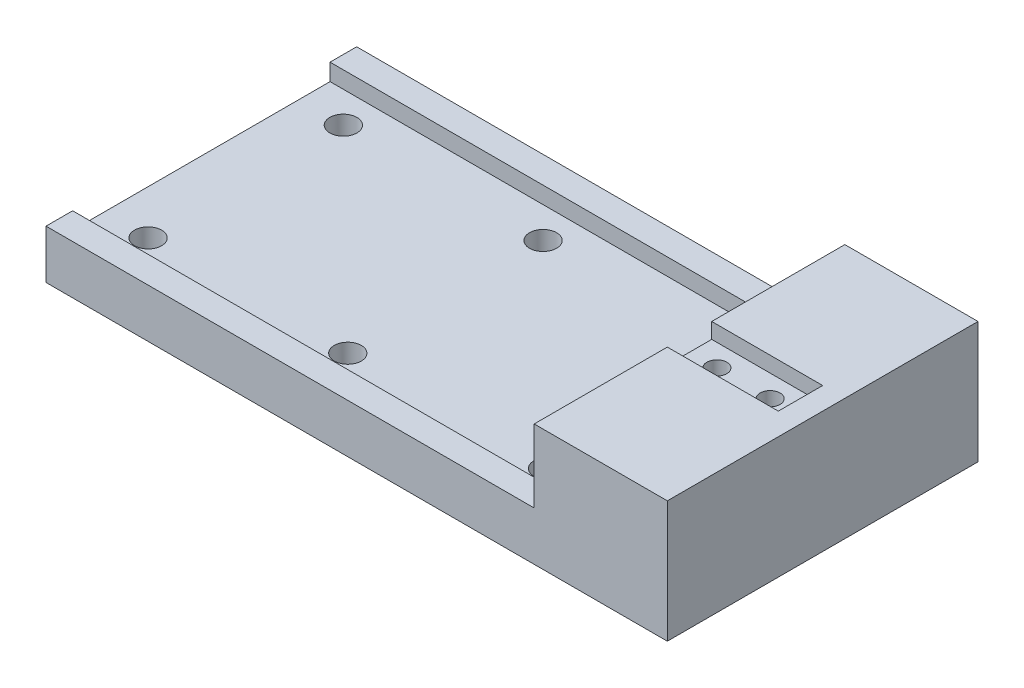
ISO-10303-21;
HEADER;
FILE_DESCRIPTION(('STEP AP214'),'2;1');
FILE_NAME('part.step','',(''),(''),'','','');
FILE_SCHEMA(('AUTOMOTIVE_DESIGN { 1 0 10303 214 1 1 1 1 }'));
ENDSEC;
DATA;
#1=APPLICATION_CONTEXT('core data for automotive mechanical design processes');
#2=APPLICATION_PROTOCOL_DEFINITION('international standard','automotive_design',2000,#1);
#3=PRODUCT_CONTEXT('',#1,'mechanical');
#4=PRODUCT('Part','Part','',(#3));
#5=PRODUCT_RELATED_PRODUCT_CATEGORY('part','',(#4));
#6=PRODUCT_DEFINITION_FORMATION('','',#4);
#7=PRODUCT_DEFINITION_CONTEXT('part definition',#1,'design');
#8=PRODUCT_DEFINITION('design','',#6,#7);
#9=PRODUCT_DEFINITION_SHAPE('','',#8);
#10=(LENGTH_UNIT() NAMED_UNIT(*) SI_UNIT(.MILLI.,.METRE.));
#11=(NAMED_UNIT(*) PLANE_ANGLE_UNIT() SI_UNIT($,.RADIAN.));
#12=(NAMED_UNIT(*) SI_UNIT($,.STERADIAN.) SOLID_ANGLE_UNIT());
#13=UNCERTAINTY_MEASURE_WITH_UNIT(LENGTH_MEASURE(1.E-05),#10,'distance_accuracy_value','');
#14=(GEOMETRIC_REPRESENTATION_CONTEXT(3) GLOBAL_UNCERTAINTY_ASSIGNED_CONTEXT((#13)) GLOBAL_UNIT_ASSIGNED_CONTEXT((#10,
#11,#12)) REPRESENTATION_CONTEXT('',''));
#15=CARTESIAN_POINT('',(0.,0.,0.));
#16=DIRECTION('',(0.,0.,1.));
#17=DIRECTION('',(1.,0.,0.));
#18=AXIS2_PLACEMENT_3D('',#15,#16,#17);
#19=CARTESIAN_POINT('',(-70.,-5.5,70.));
#20=DIRECTION('',(0.,1.,0.));
#21=DIRECTION('',(0.,0.,1.));
#22=AXIS2_PLACEMENT_3D('',#19,#20,#21);
#23=PLANE('',#22);
#24=CARTESIAN_POINT('',(-15.,-5.5,13.));
#25=DIRECTION('',(0.,1.,0.));
#26=DIRECTION('',(0.,0.,1.));
#27=AXIS2_PLACEMENT_3D('',#24,#25,#26);
#28=CIRCLE('',#27,3.05);
#29=CARTESIAN_POINT('',(-15.,-5.5,16.05));
#30=VERTEX_POINT('',#29);
#31=EDGE_CURVE('E407',#30,#30,#28,.T.);
#32=ORIENTED_EDGE('',*,*,#31,.T.);
#33=EDGE_LOOP('',(#32));
#34=FACE_BOUND('',#33,.T.);
#35=CARTESIAN_POINT('',(30.,-5.5,13.));
#36=DIRECTION('',(0.,1.,0.));
#37=DIRECTION('',(0.,0.,1.));
#38=AXIS2_PLACEMENT_3D('',#35,#36,#37);
#39=CIRCLE('',#38,3.05000000000001);
#40=CARTESIAN_POINT('',(30.,-5.5,16.05));
#41=VERTEX_POINT('',#40);
#42=EDGE_CURVE('E193',#41,#41,#39,.T.);
#43=ORIENTED_EDGE('',*,*,#42,.T.);
#44=EDGE_LOOP('',(#43));
#45=FACE_BOUND('',#44,.T.);
#46=CARTESIAN_POINT('',(-60.,-5.5,13.));
#47=DIRECTION('',(0.,1.,0.));
#48=DIRECTION('',(0.,0.,1.));
#49=AXIS2_PLACEMENT_3D('',#46,#47,#48);
#50=CIRCLE('',#49,3.05);
#51=CARTESIAN_POINT('',(-60.,-5.5,16.05));
#52=VERTEX_POINT('',#51);
#53=EDGE_CURVE('E410',#52,#52,#50,.T.);
#54=ORIENTED_EDGE('',*,*,#53,.T.);
#55=EDGE_LOOP('',(#54));
#56=FACE_BOUND('',#55,.T.);
#57=DIRECTION('',(1.,0.,0.));
#58=VECTOR('',#57,1.);
#59=CARTESIAN_POINT('',(-70.,-5.5,0.));
#60=LINE('',#59,#58);
#61=CARTESIAN_POINT('',(-70.,-5.5,0.));
#62=VERTEX_POINT('',#61);
#63=CARTESIAN_POINT('',(70.,-5.5,0.));
#64=VERTEX_POINT('',#63);
#65=EDGE_CURVE('E298',#62,#64,#60,.T.);
#66=ORIENTED_EDGE('',*,*,#65,.T.);
#67=DIRECTION('',(0.,0.,-1.));
#68=VECTOR('',#67,1.);
#69=CARTESIAN_POINT('',(70.,-5.5,70.));
#70=LINE('',#69,#68);
#71=CARTESIAN_POINT('',(70.,-5.5,70.));
#72=VERTEX_POINT('',#71);
#73=EDGE_CURVE('E304',#72,#64,#70,.T.);
#74=ORIENTED_EDGE('',*,*,#73,.F.);
#75=DIRECTION('',(1.,0.,0.));
#76=VECTOR('',#75,1.);
#77=CARTESIAN_POINT('',(-70.,-5.5,70.));
#78=LINE('',#77,#76);
#79=CARTESIAN_POINT('',(-70.,-5.5,70.));
#80=VERTEX_POINT('',#79);
#81=EDGE_CURVE('E302',#80,#72,#78,.T.);
#82=ORIENTED_EDGE('',*,*,#81,.F.);
#83=DIRECTION('',(0.,0.,-1.));
#84=VECTOR('',#83,1.);
#85=CARTESIAN_POINT('',(-70.,-5.5,70.));
#86=LINE('',#85,#84);
#87=EDGE_CURVE('E314',#80,#62,#86,.T.);
#88=ORIENTED_EDGE('',*,*,#87,.T.);
#89=EDGE_LOOP('',(#66,#74,#82,#88));
#90=FACE_BOUND('',#89,.T.);
#91=CARTESIAN_POINT('',(-15.,-5.5,57.));
#92=DIRECTION('',(0.,1.,0.));
#93=DIRECTION('',(0.,0.,1.));
#94=AXIS2_PLACEMENT_3D('',#91,#92,#93);
#95=CIRCLE('',#94,3.05);
#96=CARTESIAN_POINT('',(-15.,-5.5,60.05));
#97=VERTEX_POINT('',#96);
#98=EDGE_CURVE('E424',#97,#97,#95,.F.);
#99=ORIENTED_EDGE('',*,*,#98,.F.);
#100=EDGE_LOOP('',(#99));
#101=FACE_BOUND('',#100,.T.);
#102=CARTESIAN_POINT('',(-60.,-5.5,57.));
#103=DIRECTION('',(0.,1.,0.));
#104=DIRECTION('',(0.,0.,1.));
#105=AXIS2_PLACEMENT_3D('',#102,#103,#104);
#106=CIRCLE('',#105,3.05);
#107=CARTESIAN_POINT('',(-60.,-5.5,60.05));
#108=VERTEX_POINT('',#107);
#109=EDGE_CURVE('E430',#108,#108,#106,.F.);
#110=ORIENTED_EDGE('',*,*,#109,.F.);
#111=EDGE_LOOP('',(#110));
#112=FACE_BOUND('',#111,.T.);
#113=CARTESIAN_POINT('',(30.,-5.5,57.));
#114=DIRECTION('',(0.,1.,0.));
#115=DIRECTION('',(0.,0.,1.));
#116=AXIS2_PLACEMENT_3D('',#113,#114,#115);
#117=CIRCLE('',#116,3.05);
#118=CARTESIAN_POINT('',(30.,-5.5,60.05));
#119=VERTEX_POINT('',#118);
#120=EDGE_CURVE('E418',#119,#119,#117,.F.);
#121=ORIENTED_EDGE('',*,*,#120,.F.);
#122=EDGE_LOOP('',(#121));
#123=FACE_BOUND('',#122,.T.);
#124=ADVANCED_FACE('F40',(#34,#45,#56,#90,#101,#112,#123),#23,.F.);
#125=CARTESIAN_POINT('',(-70.,5.5,70.));
#126=DIRECTION('',(0.,-1.,0.));
#127=DIRECTION('',(0.,0.,-1.));
#128=AXIS2_PLACEMENT_3D('',#125,#126,#127);
#129=PLANE('',#128);
#130=DIRECTION('',(0.,0.,-1.));
#131=VECTOR('',#130,1.);
#132=CARTESIAN_POINT('',(40.,5.5,70.));
#133=LINE('',#132,#131);
#134=CARTESIAN_POINT('',(40.,5.5,70.));
#135=VERTEX_POINT('',#134);
#136=CARTESIAN_POINT('',(40.,5.5,64.));
#137=VERTEX_POINT('',#136);
#138=EDGE_CURVE('E277',#135,#137,#133,.T.);
#139=ORIENTED_EDGE('',*,*,#138,.T.);
#140=DIRECTION('',(1.,0.,0.));
#141=VECTOR('',#140,1.);
#142=CARTESIAN_POINT('',(0.,5.5,64.));
#143=LINE('',#142,#141);
#144=CARTESIAN_POINT('',(-70.,5.5,64.));
#145=VERTEX_POINT('',#144);
#146=EDGE_CURVE('E57',#145,#137,#143,.T.);
#147=ORIENTED_EDGE('',*,*,#146,.F.);
#148=DIRECTION('',(0.,0.,-1.));
#149=VECTOR('',#148,1.);
#150=CARTESIAN_POINT('',(-70.,5.5,70.));
#151=LINE('',#150,#149);
#152=CARTESIAN_POINT('',(-70.,5.5,70.));
#153=VERTEX_POINT('',#152);
#154=EDGE_CURVE('E13',#153,#145,#151,.T.);
#155=ORIENTED_EDGE('',*,*,#154,.F.);
#156=DIRECTION('',(-1.,0.,0.));
#157=VECTOR('',#156,1.);
#158=CARTESIAN_POINT('',(-70.,5.5,70.));
#159=LINE('',#158,#157);
#160=EDGE_CURVE('E297',#135,#153,#159,.T.);
#161=ORIENTED_EDGE('',*,*,#160,.F.);
#162=EDGE_LOOP('',(#139,#147,#155,#161));
#163=FACE_BOUND('',#162,.T.);
#164=ADVANCED_FACE('F338',(#163),#129,.F.);
#165=DIRECTION('',(1.,0.,0.));
#166=VECTOR('',#165,1.);
#167=CARTESIAN_POINT('',(0.,5.5,6.));
#168=LINE('',#167,#166);
#169=CARTESIAN_POINT('',(-70.,5.5,6.));
#170=VERTEX_POINT('',#169);
#171=CARTESIAN_POINT('',(40.,5.5,6.));
#172=VERTEX_POINT('',#171);
#173=EDGE_CURVE('E177',#170,#172,#168,.T.);
#174=ORIENTED_EDGE('',*,*,#173,.T.);
#175=CARTESIAN_POINT('',(40.,5.5,0.));
#176=VERTEX_POINT('',#175);
#177=EDGE_CURVE('E184',#172,#176,#133,.T.);
#178=ORIENTED_EDGE('',*,*,#177,.T.);
#179=DIRECTION('',(-1.,0.,0.));
#180=VECTOR('',#179,1.);
#181=CARTESIAN_POINT('',(-70.,5.5,0.));
#182=LINE('',#181,#180);
#183=CARTESIAN_POINT('',(-70.,5.5,0.));
#184=VERTEX_POINT('',#183);
#185=EDGE_CURVE('E306',#176,#184,#182,.T.);
#186=ORIENTED_EDGE('',*,*,#185,.T.);
#187=EDGE_CURVE('E49',#170,#184,#151,.T.);
#188=ORIENTED_EDGE('',*,*,#187,.F.);
#189=EDGE_LOOP('',(#174,#178,#186,#188));
#190=FACE_BOUND('',#189,.T.);
#191=ADVANCED_FACE('F344',(#190),#129,.F.);
#192=CARTESIAN_POINT('',(-70.,5.5,70.));
#193=DIRECTION('',(1.,0.,0.));
#194=DIRECTION('',(0.,0.,-1.));
#195=AXIS2_PLACEMENT_3D('',#192,#193,#194);
#196=PLANE('',#195);
#197=ORIENTED_EDGE('',*,*,#154,.T.);
#198=DIRECTION('',(0.,1.,0.));
#199=VECTOR('',#198,1.);
#200=CARTESIAN_POINT('',(-70.,-128.454332453679,64.));
#201=LINE('',#200,#199);
#202=CARTESIAN_POINT('',(-70.,1.70000000000001,64.));
#203=VERTEX_POINT('',#202);
#204=EDGE_CURVE('E207',#203,#145,#201,.T.);
#205=ORIENTED_EDGE('',*,*,#204,.F.);
#206=DIRECTION('',(0.,0.,1.));
#207=VECTOR('',#206,1.);
#208=CARTESIAN_POINT('',(-70.,1.70000000000001,0.));
#209=LINE('',#208,#207);
#210=CARTESIAN_POINT('',(-70.,1.70000000000001,6.));
#211=VERTEX_POINT('',#210);
#212=EDGE_CURVE('E192',#211,#203,#209,.T.);
#213=ORIENTED_EDGE('',*,*,#212,.F.);
#214=DIRECTION('',(0.,1.,0.));
#215=VECTOR('',#214,1.);
#216=CARTESIAN_POINT('',(-70.,-128.454332453679,6.));
#217=LINE('',#216,#215);
#218=EDGE_CURVE('E187',#211,#170,#217,.T.);
#219=ORIENTED_EDGE('',*,*,#218,.T.);
#220=ORIENTED_EDGE('',*,*,#187,.T.);
#221=DIRECTION('',(0.,-1.,0.));
#222=VECTOR('',#221,1.);
#223=CARTESIAN_POINT('',(-70.,5.5,0.));
#224=LINE('',#223,#222);
#225=EDGE_CURVE('E309',#184,#62,#224,.T.);
#226=ORIENTED_EDGE('',*,*,#225,.T.);
#227=ORIENTED_EDGE('',*,*,#87,.F.);
#228=DIRECTION('',(0.,-1.,0.));
#229=VECTOR('',#228,1.);
#230=CARTESIAN_POINT('',(-70.,5.5,70.));
#231=LINE('',#230,#229);
#232=EDGE_CURVE('E300',#153,#80,#231,.T.);
#233=ORIENTED_EDGE('',*,*,#232,.F.);
#234=EDGE_LOOP('',(#197,#205,#213,#219,#220,#226,#227,#233));
#235=FACE_BOUND('',#234,.T.);
#236=ADVANCED_FACE('F352',(#235),#196,.F.);
#237=CARTESIAN_POINT('',(70.,5.5,70.));
#238=DIRECTION('',(-1.,0.,0.));
#239=DIRECTION('',(0.,0.,1.));
#240=AXIS2_PLACEMENT_3D('',#237,#238,#239);
#241=PLANE('',#240);
#242=DIRECTION('',(0.,1.,0.));
#243=VECTOR('',#242,1.);
#244=CARTESIAN_POINT('',(70.,5.5,0.));
#245=LINE('',#244,#243);
#246=CARTESIAN_POINT('',(70.,21.9,0.));
#247=VERTEX_POINT('',#246);
#248=EDGE_CURVE('E292',#64,#247,#245,.T.);
#249=ORIENTED_EDGE('',*,*,#248,.T.);
#250=DIRECTION('',(0.,0.,-1.));
#251=VECTOR('',#250,1.);
#252=CARTESIAN_POINT('',(70.,21.9,70.));
#253=LINE('',#252,#251);
#254=CARTESIAN_POINT('',(70.,21.9,70.));
#255=VERTEX_POINT('',#254);
#256=EDGE_CURVE('E284',#255,#247,#253,.T.);
#257=ORIENTED_EDGE('',*,*,#256,.F.);
#258=DIRECTION('',(0.,1.,0.));
#259=VECTOR('',#258,1.);
#260=CARTESIAN_POINT('',(70.,5.5,70.));
#261=LINE('',#260,#259);
#262=EDGE_CURVE('E295',#72,#255,#261,.T.);
#263=ORIENTED_EDGE('',*,*,#262,.F.);
#264=ORIENTED_EDGE('',*,*,#73,.T.);
#265=EDGE_LOOP('',(#249,#257,#263,#264));
#266=FACE_BOUND('',#265,.T.);
#267=ADVANCED_FACE('F42',(#266),#241,.F.);
#268=CARTESIAN_POINT('',(0.,0.,70.));
#269=DIRECTION('',(0.,0.,1.));
#270=DIRECTION('',(1.,0.,0.));
#271=AXIS2_PLACEMENT_3D('',#268,#269,#270);
#272=PLANE('',#271);
#273=ORIENTED_EDGE('',*,*,#262,.T.);
#274=DIRECTION('',(-1.,0.,0.));
#275=VECTOR('',#274,1.);
#276=CARTESIAN_POINT('',(70.,21.9,70.));
#277=LINE('',#276,#275);
#278=CARTESIAN_POINT('',(40.,21.9,70.));
#279=VERTEX_POINT('',#278);
#280=EDGE_CURVE('E273',#255,#279,#277,.T.);
#281=ORIENTED_EDGE('',*,*,#280,.T.);
#282=DIRECTION('',(0.,-1.,0.));
#283=VECTOR('',#282,1.);
#284=CARTESIAN_POINT('',(40.,21.9,70.));
#285=LINE('',#284,#283);
#286=EDGE_CURVE('E287',#279,#135,#285,.T.);
#287=ORIENTED_EDGE('',*,*,#286,.T.);
#288=ORIENTED_EDGE('',*,*,#160,.T.);
#289=ORIENTED_EDGE('',*,*,#232,.T.);
#290=ORIENTED_EDGE('',*,*,#81,.T.);
#291=EDGE_LOOP('',(#273,#281,#287,#288,#289,#290));
#292=FACE_BOUND('',#291,.T.);
#293=ADVANCED_FACE('F359',(#292),#272,.T.);
#294=CARTESIAN_POINT('',(0.,0.,0.));
#295=DIRECTION('',(0.,0.,1.));
#296=DIRECTION('',(1.,0.,0.));
#297=AXIS2_PLACEMENT_3D('',#294,#295,#296);
#298=PLANE('',#297);
#299=ORIENTED_EDGE('',*,*,#248,.F.);
#300=ORIENTED_EDGE('',*,*,#65,.F.);
#301=ORIENTED_EDGE('',*,*,#225,.F.);
#302=ORIENTED_EDGE('',*,*,#185,.F.);
#303=DIRECTION('',(0.,-1.,0.));
#304=VECTOR('',#303,1.);
#305=CARTESIAN_POINT('',(40.,21.9,0.));
#306=LINE('',#305,#304);
#307=CARTESIAN_POINT('',(40.,21.9,0.));
#308=VERTEX_POINT('',#307);
#309=EDGE_CURVE('E290',#308,#176,#306,.T.);
#310=ORIENTED_EDGE('',*,*,#309,.F.);
#311=DIRECTION('',(-1.,0.,0.));
#312=VECTOR('',#311,1.);
#313=CARTESIAN_POINT('',(70.,21.9,0.));
#314=LINE('',#313,#312);
#315=EDGE_CURVE('E281',#247,#308,#314,.T.);
#316=ORIENTED_EDGE('',*,*,#315,.F.);
#317=EDGE_LOOP('',(#299,#300,#301,#302,#310,#316));
#318=FACE_BOUND('',#317,.T.);
#319=ADVANCED_FACE('F350',(#318),#298,.F.);
#320=CARTESIAN_POINT('',(40.,5.5,70.));
#321=DIRECTION('',(-1.,0.,0.));
#322=DIRECTION('',(0.,0.,1.));
#323=AXIS2_PLACEMENT_3D('',#320,#321,#322);
#324=PLANE('',#323);
#325=DIRECTION('',(0.,1.,0.));
#326=VECTOR('',#325,1.);
#327=CARTESIAN_POINT('',(40.,-128.454332453679,6.));
#328=LINE('',#327,#326);
#329=CARTESIAN_POINT('',(40.,1.70000000000001,6.));
#330=VERTEX_POINT('',#329);
#331=EDGE_CURVE('E180',#330,#172,#328,.T.);
#332=ORIENTED_EDGE('',*,*,#331,.F.);
#333=DIRECTION('',(0.,0.,1.));
#334=VECTOR('',#333,1.);
#335=CARTESIAN_POINT('',(40.0000000000001,1.70000000000001,0.));
#336=LINE('',#335,#334);
#337=CARTESIAN_POINT('',(40.,1.70000000000001,64.));
#338=VERTEX_POINT('',#337);
#339=EDGE_CURVE('E168',#330,#338,#336,.T.);
#340=ORIENTED_EDGE('',*,*,#339,.T.);
#341=DIRECTION('',(0.,1.,0.));
#342=VECTOR('',#341,1.);
#343=CARTESIAN_POINT('',(40.,-128.454332453679,64.));
#344=LINE('',#343,#342);
#345=EDGE_CURVE('E204',#338,#137,#344,.T.);
#346=ORIENTED_EDGE('',*,*,#345,.T.);
#347=ORIENTED_EDGE('',*,*,#138,.F.);
#348=ORIENTED_EDGE('',*,*,#286,.F.);
#349=DIRECTION('',(0.,0.,-1.));
#350=VECTOR('',#349,1.);
#351=CARTESIAN_POINT('',(40.,21.9,70.));
#352=LINE('',#351,#350);
#353=CARTESIAN_POINT('',(40.,21.9,40.));
#354=VERTEX_POINT('',#353);
#355=EDGE_CURVE('E278',#279,#354,#352,.T.);
#356=ORIENTED_EDGE('',*,*,#355,.T.);
#357=DIRECTION('',(0.,1.,0.));
#358=VECTOR('',#357,1.);
#359=CARTESIAN_POINT('',(40.,18.4,40.));
#360=LINE('',#359,#358);
#361=CARTESIAN_POINT('',(40.,18.4,40.));
#362=VERTEX_POINT('',#361);
#363=EDGE_CURVE('E262',#362,#354,#360,.T.);
#364=ORIENTED_EDGE('',*,*,#363,.F.);
#365=DIRECTION('',(0.,0.,1.));
#366=VECTOR('',#365,1.);
#367=CARTESIAN_POINT('',(40.,18.4,30.));
#368=LINE('',#367,#366);
#369=CARTESIAN_POINT('',(40.,18.4,30.));
#370=VERTEX_POINT('',#369);
#371=EDGE_CURVE('E259',#370,#362,#368,.T.);
#372=ORIENTED_EDGE('',*,*,#371,.F.);
#373=DIRECTION('',(0.,-1.,0.));
#374=VECTOR('',#373,1.);
#375=CARTESIAN_POINT('',(40.,18.4,30.));
#376=LINE('',#375,#374);
#377=CARTESIAN_POINT('',(40.,21.9,30.));
#378=VERTEX_POINT('',#377);
#379=EDGE_CURVE('E251',#378,#370,#376,.T.);
#380=ORIENTED_EDGE('',*,*,#379,.F.);
#381=EDGE_CURVE('E276',#378,#308,#352,.T.);
#382=ORIENTED_EDGE('',*,*,#381,.T.);
#383=ORIENTED_EDGE('',*,*,#309,.T.);
#384=ORIENTED_EDGE('',*,*,#177,.F.);
#385=EDGE_LOOP('',(#332,#340,#346,#347,#348,#356,#364,#372,#380,#382,#383,#384));
#386=FACE_BOUND('',#385,.T.);
#387=DIRECTION('',(0.,-1.,0.));
#388=VECTOR('',#387,1.);
#389=CARTESIAN_POINT('',(40.,11.,30.));
#390=LINE('',#389,#388);
#391=CARTESIAN_POINT('',(40.,11.,30.));
#392=VERTEX_POINT('',#391);
#393=CARTESIAN_POINT('',(40.,7.50000000000001,30.));
#394=VERTEX_POINT('',#393);
#395=EDGE_CURVE('E65',#392,#394,#390,.T.);
#396=ORIENTED_EDGE('',*,*,#395,.F.);
#397=DIRECTION('',(0.,0.,-1.));
#398=VECTOR('',#397,1.);
#399=CARTESIAN_POINT('',(40.,11.,30.));
#400=LINE('',#399,#398);
#401=CARTESIAN_POINT('',(40.,11.,40.));
#402=VERTEX_POINT('',#401);
#403=EDGE_CURVE('E220',#402,#392,#400,.T.);
#404=ORIENTED_EDGE('',*,*,#403,.F.);
#405=DIRECTION('',(0.,1.,0.));
#406=VECTOR('',#405,1.);
#407=CARTESIAN_POINT('',(40.,11.,40.));
#408=LINE('',#407,#406);
#409=CARTESIAN_POINT('',(40.,7.50000000000001,40.));
#410=VERTEX_POINT('',#409);
#411=EDGE_CURVE('E235',#410,#402,#408,.T.);
#412=ORIENTED_EDGE('',*,*,#411,.F.);
#413=DIRECTION('',(0.,0.,1.));
#414=VECTOR('',#413,1.);
#415=CARTESIAN_POINT('',(40.,7.50000000000001,30.));
#416=LINE('',#415,#414);
#417=EDGE_CURVE('E231',#394,#410,#416,.T.);
#418=ORIENTED_EDGE('',*,*,#417,.F.);
#419=EDGE_LOOP('',(#396,#404,#412,#418));
#420=FACE_BOUND('',#419,.T.);
#421=ADVANCED_FACE('F181',(#386,#420),#324,.T.);
#422=CARTESIAN_POINT('',(0.,21.9,0.));
#423=DIRECTION('',(0.,-1.,0.));
#424=DIRECTION('',(0.,0.,-1.));
#425=AXIS2_PLACEMENT_3D('',#422,#423,#424);
#426=PLANE('',#425);
#427=ORIENTED_EDGE('',*,*,#381,.F.);
#428=DIRECTION('',(-1.,0.,0.));
#429=VECTOR('',#428,1.);
#430=CARTESIAN_POINT('',(65.,21.9,30.));
#431=LINE('',#430,#429);
#432=CARTESIAN_POINT('',(65.,21.9,30.));
#433=VERTEX_POINT('',#432);
#434=EDGE_CURVE('E267',#433,#378,#431,.T.);
#435=ORIENTED_EDGE('',*,*,#434,.F.);
#436=DIRECTION('',(0.,0.,-1.));
#437=VECTOR('',#436,1.);
#438=CARTESIAN_POINT('',(65.,21.9,30.));
#439=LINE('',#438,#437);
#440=CARTESIAN_POINT('',(65.,21.9,40.));
#441=VERTEX_POINT('',#440);
#442=EDGE_CURVE('E253',#441,#433,#439,.T.);
#443=ORIENTED_EDGE('',*,*,#442,.F.);
#444=DIRECTION('',(-1.,0.,0.));
#445=VECTOR('',#444,1.);
#446=CARTESIAN_POINT('',(65.,21.9,40.));
#447=LINE('',#446,#445);
#448=EDGE_CURVE('E269',#441,#354,#447,.T.);
#449=ORIENTED_EDGE('',*,*,#448,.T.);
#450=ORIENTED_EDGE('',*,*,#355,.F.);
#451=ORIENTED_EDGE('',*,*,#280,.F.);
#452=ORIENTED_EDGE('',*,*,#256,.T.);
#453=ORIENTED_EDGE('',*,*,#315,.T.);
#454=EDGE_LOOP('',(#427,#435,#443,#449,#450,#451,#452,#453));
#455=FACE_BOUND('',#454,.T.);
#456=ADVANCED_FACE('F468',(#455),#426,.F.);
#457=CARTESIAN_POINT('',(65.,18.4,30.));
#458=DIRECTION('',(0.,-1.,0.));
#459=DIRECTION('',(0.,0.,-1.));
#460=AXIS2_PLACEMENT_3D('',#457,#458,#459);
#461=PLANE('',#460);
#462=CARTESIAN_POINT('',(58.15,18.4,35.));
#463=DIRECTION('',(0.,1.,0.));
#464=DIRECTION('',(0.,0.,1.));
#465=AXIS2_PLACEMENT_3D('',#462,#463,#464);
#466=CIRCLE('',#465,2.25);
#467=CARTESIAN_POINT('',(58.15,18.4,37.25));
#468=VERTEX_POINT('',#467);
#469=EDGE_CURVE('E210',#468,#468,#466,.T.);
#470=ORIENTED_EDGE('',*,*,#469,.F.);
#471=EDGE_LOOP('',(#470));
#472=FACE_BOUND('',#471,.T.);
#473=CARTESIAN_POINT('',(46.15,18.4,35.));
#474=DIRECTION('',(0.,1.,0.));
#475=DIRECTION('',(0.,0.,1.));
#476=AXIS2_PLACEMENT_3D('',#473,#474,#475);
#477=CIRCLE('',#476,2.25);
#478=CARTESIAN_POINT('',(46.15,18.4,37.25));
#479=VERTEX_POINT('',#478);
#480=EDGE_CURVE('E206',#479,#479,#477,.T.);
#481=ORIENTED_EDGE('',*,*,#480,.F.);
#482=EDGE_LOOP('',(#481));
#483=FACE_BOUND('',#482,.T.);
#484=ORIENTED_EDGE('',*,*,#371,.T.);
#485=DIRECTION('',(-1.,0.,0.));
#486=VECTOR('',#485,1.);
#487=CARTESIAN_POINT('',(65.,18.4,40.));
#488=LINE('',#487,#486);
#489=CARTESIAN_POINT('',(65.,18.4,40.));
#490=VERTEX_POINT('',#489);
#491=EDGE_CURVE('E258',#490,#362,#488,.T.);
#492=ORIENTED_EDGE('',*,*,#491,.F.);
#493=DIRECTION('',(0.,0.,1.));
#494=VECTOR('',#493,1.);
#495=CARTESIAN_POINT('',(65.,18.4,30.));
#496=LINE('',#495,#494);
#497=CARTESIAN_POINT('',(65.,18.4,30.));
#498=VERTEX_POINT('',#497);
#499=EDGE_CURVE('E247',#498,#490,#496,.T.);
#500=ORIENTED_EDGE('',*,*,#499,.F.);
#501=DIRECTION('',(-1.,0.,0.));
#502=VECTOR('',#501,1.);
#503=CARTESIAN_POINT('',(65.,18.4,30.));
#504=LINE('',#503,#502);
#505=EDGE_CURVE('E232',#498,#370,#504,.T.);
#506=ORIENTED_EDGE('',*,*,#505,.T.);
#507=EDGE_LOOP('',(#484,#492,#500,#506));
#508=FACE_BOUND('',#507,.T.);
#509=ADVANCED_FACE('F488',(#472,#483,#508),#461,.F.);
#510=CARTESIAN_POINT('',(65.,18.4,30.));
#511=DIRECTION('',(0.,0.,-1.));
#512=DIRECTION('',(0.,1.,0.));
#513=AXIS2_PLACEMENT_3D('',#510,#511,#512);
#514=PLANE('',#513);
#515=ORIENTED_EDGE('',*,*,#379,.T.);
#516=ORIENTED_EDGE('',*,*,#505,.F.);
#517=DIRECTION('',(0.,-1.,0.));
#518=VECTOR('',#517,1.);
#519=CARTESIAN_POINT('',(65.,18.4,30.));
#520=LINE('',#519,#518);
#521=EDGE_CURVE('E255',#433,#498,#520,.T.);
#522=ORIENTED_EDGE('',*,*,#521,.F.);
#523=ORIENTED_EDGE('',*,*,#434,.T.);
#524=EDGE_LOOP('',(#515,#516,#522,#523));
#525=FACE_BOUND('',#524,.T.);
#526=ADVANCED_FACE('F477',(#525),#514,.F.);
#527=CARTESIAN_POINT('',(65.,18.4,40.));
#528=DIRECTION('',(0.,0.,1.));
#529=DIRECTION('',(0.,-1.,0.));
#530=AXIS2_PLACEMENT_3D('',#527,#528,#529);
#531=PLANE('',#530);
#532=ORIENTED_EDGE('',*,*,#363,.T.);
#533=ORIENTED_EDGE('',*,*,#448,.F.);
#534=DIRECTION('',(0.,1.,0.));
#535=VECTOR('',#534,1.);
#536=CARTESIAN_POINT('',(65.,18.4,40.));
#537=LINE('',#536,#535);
#538=EDGE_CURVE('E250',#490,#441,#537,.T.);
#539=ORIENTED_EDGE('',*,*,#538,.F.);
#540=ORIENTED_EDGE('',*,*,#491,.T.);
#541=EDGE_LOOP('',(#532,#533,#539,#540));
#542=FACE_BOUND('',#541,.T.);
#543=ADVANCED_FACE('F486',(#542),#531,.F.);
#544=CARTESIAN_POINT('',(65.,0.,0.));
#545=DIRECTION('',(-1.,0.,0.));
#546=DIRECTION('',(0.,0.,1.));
#547=AXIS2_PLACEMENT_3D('',#544,#545,#546);
#548=PLANE('',#547);
#549=ORIENTED_EDGE('',*,*,#499,.T.);
#550=ORIENTED_EDGE('',*,*,#538,.T.);
#551=ORIENTED_EDGE('',*,*,#442,.T.);
#552=ORIENTED_EDGE('',*,*,#521,.T.);
#553=EDGE_LOOP('',(#549,#550,#551,#552));
#554=FACE_BOUND('',#553,.T.);
#555=ADVANCED_FACE('F483',(#554),#548,.T.);
#556=CARTESIAN_POINT('',(65.,11.,30.));
#557=DIRECTION('',(0.,0.,-1.));
#558=DIRECTION('',(-1.,0.,0.));
#559=AXIS2_PLACEMENT_3D('',#556,#557,#558);
#560=PLANE('',#559);
#561=ORIENTED_EDGE('',*,*,#395,.T.);
#562=DIRECTION('',(-1.,0.,0.));
#563=VECTOR('',#562,1.);
#564=CARTESIAN_POINT('',(65.,7.50000000000001,30.));
#565=LINE('',#564,#563);
#566=CARTESIAN_POINT('',(65.,7.50000000000001,30.));
#567=VERTEX_POINT('',#566);
#568=EDGE_CURVE('E229',#567,#394,#565,.T.);
#569=ORIENTED_EDGE('',*,*,#568,.F.);
#570=DIRECTION('',(0.,-1.,0.));
#571=VECTOR('',#570,1.);
#572=CARTESIAN_POINT('',(65.,11.,30.));
#573=LINE('',#572,#571);
#574=CARTESIAN_POINT('',(65.,11.,30.));
#575=VERTEX_POINT('',#574);
#576=EDGE_CURVE('E216',#575,#567,#573,.T.);
#577=ORIENTED_EDGE('',*,*,#576,.F.);
#578=DIRECTION('',(-1.,0.,0.));
#579=VECTOR('',#578,1.);
#580=CARTESIAN_POINT('',(65.,11.,30.));
#581=LINE('',#580,#579);
#582=EDGE_CURVE('E240',#575,#392,#581,.T.);
#583=ORIENTED_EDGE('',*,*,#582,.T.);
#584=EDGE_LOOP('',(#561,#569,#577,#583));
#585=FACE_BOUND('',#584,.T.);
#586=ADVANCED_FACE('F542',(#585),#560,.F.);
#587=CARTESIAN_POINT('',(65.,11.,30.));
#588=DIRECTION('',(0.,1.,0.));
#589=DIRECTION('',(0.,0.,1.));
#590=AXIS2_PLACEMENT_3D('',#587,#588,#589);
#591=PLANE('',#590);
#592=CARTESIAN_POINT('',(58.15,11.,35.));
#593=DIRECTION('',(0.,1.,0.));
#594=DIRECTION('',(0.,0.,1.));
#595=AXIS2_PLACEMENT_3D('',#592,#593,#594);
#596=CIRCLE('',#595,2.25);
#597=CARTESIAN_POINT('',(58.15,11.,37.25));
#598=VERTEX_POINT('',#597);
#599=EDGE_CURVE('E44',#598,#598,#596,.T.);
#600=ORIENTED_EDGE('',*,*,#599,.T.);
#601=EDGE_LOOP('',(#600));
#602=FACE_BOUND('',#601,.T.);
#603=CARTESIAN_POINT('',(46.15,11.,35.));
#604=DIRECTION('',(0.,1.,0.));
#605=DIRECTION('',(0.,0.,1.));
#606=AXIS2_PLACEMENT_3D('',#603,#604,#605);
#607=CIRCLE('',#606,2.25);
#608=CARTESIAN_POINT('',(46.15,11.,37.25));
#609=VERTEX_POINT('',#608);
#610=EDGE_CURVE('E213',#609,#609,#607,.T.);
#611=ORIENTED_EDGE('',*,*,#610,.T.);
#612=EDGE_LOOP('',(#611));
#613=FACE_BOUND('',#612,.T.);
#614=ORIENTED_EDGE('',*,*,#403,.T.);
#615=ORIENTED_EDGE('',*,*,#582,.F.);
#616=DIRECTION('',(0.,0.,-1.));
#617=VECTOR('',#616,1.);
#618=CARTESIAN_POINT('',(65.,11.,30.));
#619=LINE('',#618,#617);
#620=CARTESIAN_POINT('',(65.,11.,40.));
#621=VERTEX_POINT('',#620);
#622=EDGE_CURVE('E226',#621,#575,#619,.T.);
#623=ORIENTED_EDGE('',*,*,#622,.F.);
#624=DIRECTION('',(-1.,0.,0.));
#625=VECTOR('',#624,1.);
#626=CARTESIAN_POINT('',(65.,11.,40.));
#627=LINE('',#626,#625);
#628=EDGE_CURVE('E242',#621,#402,#627,.T.);
#629=ORIENTED_EDGE('',*,*,#628,.T.);
#630=EDGE_LOOP('',(#614,#615,#623,#629));
#631=FACE_BOUND('',#630,.T.);
#632=ADVANCED_FACE('F322',(#602,#613,#631),#591,.F.);
#633=CARTESIAN_POINT('',(65.,11.,40.));
#634=DIRECTION('',(0.,0.,1.));
#635=DIRECTION('',(1.,0.,0.));
#636=AXIS2_PLACEMENT_3D('',#633,#634,#635);
#637=PLANE('',#636);
#638=ORIENTED_EDGE('',*,*,#411,.T.);
#639=ORIENTED_EDGE('',*,*,#628,.F.);
#640=DIRECTION('',(0.,1.,0.));
#641=VECTOR('',#640,1.);
#642=CARTESIAN_POINT('',(65.,11.,40.));
#643=LINE('',#642,#641);
#644=CARTESIAN_POINT('',(65.,7.50000000000001,40.));
#645=VERTEX_POINT('',#644);
#646=EDGE_CURVE('E223',#645,#621,#643,.T.);
#647=ORIENTED_EDGE('',*,*,#646,.F.);
#648=DIRECTION('',(-1.,0.,0.));
#649=VECTOR('',#648,1.);
#650=CARTESIAN_POINT('',(65.,7.50000000000001,40.));
#651=LINE('',#650,#649);
#652=EDGE_CURVE('E244',#645,#410,#651,.T.);
#653=ORIENTED_EDGE('',*,*,#652,.T.);
#654=EDGE_LOOP('',(#638,#639,#647,#653));
#655=FACE_BOUND('',#654,.T.);
#656=ADVANCED_FACE('F557',(#655),#637,.F.);
#657=CARTESIAN_POINT('',(65.,7.50000000000001,30.));
#658=DIRECTION('',(0.,-1.,0.));
#659=DIRECTION('',(0.,0.,-1.));
#660=AXIS2_PLACEMENT_3D('',#657,#658,#659);
#661=PLANE('',#660);
#662=ORIENTED_EDGE('',*,*,#417,.T.);
#663=ORIENTED_EDGE('',*,*,#652,.F.);
#664=DIRECTION('',(0.,0.,1.));
#665=VECTOR('',#664,1.);
#666=CARTESIAN_POINT('',(65.,7.50000000000001,30.));
#667=LINE('',#666,#665);
#668=EDGE_CURVE('E219',#567,#645,#667,.T.);
#669=ORIENTED_EDGE('',*,*,#668,.F.);
#670=ORIENTED_EDGE('',*,*,#568,.T.);
#671=EDGE_LOOP('',(#662,#663,#669,#670));
#672=FACE_BOUND('',#671,.T.);
#673=ADVANCED_FACE('F562',(#672),#661,.F.);
#674=CARTESIAN_POINT('',(65.,0.,0.));
#675=DIRECTION('',(-1.,0.,0.));
#676=DIRECTION('',(0.,0.,1.));
#677=AXIS2_PLACEMENT_3D('',#674,#675,#676);
#678=PLANE('',#677);
#679=ORIENTED_EDGE('',*,*,#576,.T.);
#680=ORIENTED_EDGE('',*,*,#668,.T.);
#681=ORIENTED_EDGE('',*,*,#646,.T.);
#682=ORIENTED_EDGE('',*,*,#622,.T.);
#683=EDGE_LOOP('',(#679,#680,#681,#682));
#684=FACE_BOUND('',#683,.T.);
#685=ADVANCED_FACE('F334',(#684),#678,.T.);
#686=CARTESIAN_POINT('',(46.15,1.13603896932108,35.));
#687=DIRECTION('',(0.,1.,0.));
#688=DIRECTION('',(0.,0.,1.));
#689=AXIS2_PLACEMENT_3D('',#686,#687,#688);
#690=CYLINDRICAL_SURFACE('',#689,2.25);
#691=ORIENTED_EDGE('',*,*,#480,.T.);
#692=EDGE_LOOP('',(#691));
#693=FACE_BOUND('',#692,.T.);
#694=ORIENTED_EDGE('',*,*,#610,.F.);
#695=EDGE_LOOP('',(#694));
#696=FACE_BOUND('',#695,.T.);
#697=ADVANCED_FACE('F326',(#693,#696),#690,.F.);
#698=CARTESIAN_POINT('',(58.15,1.13603896932108,35.));
#699=DIRECTION('',(0.,1.,0.));
#700=DIRECTION('',(0.,0.,1.));
#701=AXIS2_PLACEMENT_3D('',#698,#699,#700);
#702=CYLINDRICAL_SURFACE('',#701,2.25);
#703=ORIENTED_EDGE('',*,*,#469,.T.);
#704=EDGE_LOOP('',(#703));
#705=FACE_BOUND('',#704,.T.);
#706=ORIENTED_EDGE('',*,*,#599,.F.);
#707=EDGE_LOOP('',(#706));
#708=FACE_BOUND('',#707,.T.);
#709=ADVANCED_FACE('F324',(#705,#708),#702,.F.);
#710=CARTESIAN_POINT('',(0.,-128.454332453679,6.));
#711=DIRECTION('',(0.,0.,1.));
#712=DIRECTION('',(1.,0.,0.));
#713=AXIS2_PLACEMENT_3D('',#710,#711,#712);
#714=PLANE('',#713);
#715=DIRECTION('',(1.,0.,0.));
#716=VECTOR('',#715,1.);
#717=CARTESIAN_POINT('',(0.,1.70000000000001,6.));
#718=LINE('',#717,#716);
#719=EDGE_CURVE('E173',#211,#330,#718,.T.);
#720=ORIENTED_EDGE('',*,*,#719,.T.);
#721=ORIENTED_EDGE('',*,*,#331,.T.);
#722=ORIENTED_EDGE('',*,*,#173,.F.);
#723=ORIENTED_EDGE('',*,*,#218,.F.);
#724=EDGE_LOOP('',(#720,#721,#722,#723));
#725=FACE_BOUND('',#724,.T.);
#726=ADVANCED_FACE('F190',(#725),#714,.T.);
#727=CARTESIAN_POINT('',(65.,1.70000000000001,30.));
#728=DIRECTION('',(0.,-1.,0.));
#729=DIRECTION('',(0.,0.,-1.));
#730=AXIS2_PLACEMENT_3D('',#727,#728,#729);
#731=PLANE('',#730);
#732=CARTESIAN_POINT('',(-60.,1.70000000000001,57.));
#733=DIRECTION('',(0.,-1.,0.));
#734=DIRECTION('',(0.,0.,-1.));
#735=AXIS2_PLACEMENT_3D('',#732,#733,#734);
#736=CIRCLE('',#735,3.05);
#737=CARTESIAN_POINT('',(-60.,1.70000000000001,53.95));
#738=VERTEX_POINT('',#737);
#739=EDGE_CURVE('E433',#738,#738,#736,.F.);
#740=ORIENTED_EDGE('',*,*,#739,.F.);
#741=EDGE_LOOP('',(#740));
#742=FACE_BOUND('',#741,.T.);
#743=CARTESIAN_POINT('',(-15.,1.70000000000001,57.));
#744=DIRECTION('',(0.,-1.,0.));
#745=DIRECTION('',(0.,0.,-1.));
#746=AXIS2_PLACEMENT_3D('',#743,#744,#745);
#747=CIRCLE('',#746,3.05);
#748=CARTESIAN_POINT('',(-15.,1.70000000000001,53.95));
#749=VERTEX_POINT('',#748);
#750=EDGE_CURVE('E427',#749,#749,#747,.F.);
#751=ORIENTED_EDGE('',*,*,#750,.F.);
#752=EDGE_LOOP('',(#751));
#753=FACE_BOUND('',#752,.T.);
#754=CARTESIAN_POINT('',(30.,1.70000000000001,57.));
#755=DIRECTION('',(0.,-1.,0.));
#756=DIRECTION('',(0.,0.,-1.));
#757=AXIS2_PLACEMENT_3D('',#754,#755,#756);
#758=CIRCLE('',#757,3.05);
#759=CARTESIAN_POINT('',(30.,1.70000000000001,53.95));
#760=VERTEX_POINT('',#759);
#761=EDGE_CURVE('E421',#760,#760,#758,.F.);
#762=ORIENTED_EDGE('',*,*,#761,.F.);
#763=EDGE_LOOP('',(#762));
#764=FACE_BOUND('',#763,.T.);
#765=ORIENTED_EDGE('',*,*,#212,.T.);
#766=DIRECTION('',(1.,0.,0.));
#767=VECTOR('',#766,1.);
#768=CARTESIAN_POINT('',(0.,1.70000000000001,64.));
#769=LINE('',#768,#767);
#770=EDGE_CURVE('E175',#203,#338,#769,.T.);
#771=ORIENTED_EDGE('',*,*,#770,.T.);
#772=ORIENTED_EDGE('',*,*,#339,.F.);
#773=ORIENTED_EDGE('',*,*,#719,.F.);
#774=EDGE_LOOP('',(#765,#771,#772,#773));
#775=FACE_BOUND('',#774,.T.);
#776=CARTESIAN_POINT('',(-15.,1.70000000000001,13.));
#777=DIRECTION('',(0.,-1.,0.));
#778=DIRECTION('',(0.,0.,-1.));
#779=AXIS2_PLACEMENT_3D('',#776,#777,#778);
#780=CIRCLE('',#779,3.05);
#781=CARTESIAN_POINT('',(-15.,1.70000000000001,9.95));
#782=VERTEX_POINT('',#781);
#783=EDGE_CURVE('E405',#782,#782,#780,.T.);
#784=ORIENTED_EDGE('',*,*,#783,.T.);
#785=EDGE_LOOP('',(#784));
#786=FACE_BOUND('',#785,.T.);
#787=CARTESIAN_POINT('',(30.,1.70000000000001,13.));
#788=DIRECTION('',(0.,-1.,0.));
#789=DIRECTION('',(0.,0.,-1.));
#790=AXIS2_PLACEMENT_3D('',#787,#788,#789);
#791=CIRCLE('',#790,3.05000000000001);
#792=CARTESIAN_POINT('',(30.,1.70000000000001,9.95));
#793=VERTEX_POINT('',#792);
#794=EDGE_CURVE('E197',#793,#793,#791,.T.);
#795=ORIENTED_EDGE('',*,*,#794,.T.);
#796=EDGE_LOOP('',(#795));
#797=FACE_BOUND('',#796,.T.);
#798=CARTESIAN_POINT('',(-60.,1.70000000000001,13.));
#799=DIRECTION('',(0.,-1.,0.));
#800=DIRECTION('',(0.,0.,-1.));
#801=AXIS2_PLACEMENT_3D('',#798,#799,#800);
#802=CIRCLE('',#801,3.05);
#803=CARTESIAN_POINT('',(-60.,1.70000000000001,9.95000000000001));
#804=VERTEX_POINT('',#803);
#805=EDGE_CURVE('E415',#804,#804,#802,.T.);
#806=ORIENTED_EDGE('',*,*,#805,.T.);
#807=EDGE_LOOP('',(#806));
#808=FACE_BOUND('',#807,.T.);
#809=ADVANCED_FACE('F170',(#742,#753,#764,#775,#786,#797,#808),#731,.F.);
#810=CARTESIAN_POINT('',(0.,-128.454332453679,64.));
#811=DIRECTION('',(0.,0.,1.));
#812=DIRECTION('',(1.,0.,0.));
#813=AXIS2_PLACEMENT_3D('',#810,#811,#812);
#814=PLANE('',#813);
#815=ORIENTED_EDGE('',*,*,#204,.T.);
#816=ORIENTED_EDGE('',*,*,#146,.T.);
#817=ORIENTED_EDGE('',*,*,#345,.F.);
#818=ORIENTED_EDGE('',*,*,#770,.F.);
#819=EDGE_LOOP('',(#815,#816,#817,#818));
#820=FACE_BOUND('',#819,.T.);
#821=ADVANCED_FACE('F368',(#820),#814,.F.);
#822=CARTESIAN_POINT('',(-15.,-6.5,57.));
#823=DIRECTION('',(0.,1.,0.));
#824=DIRECTION('',(0.,0.,1.));
#825=AXIS2_PLACEMENT_3D('',#822,#823,#824);
#826=CYLINDRICAL_SURFACE('',#825,3.05);
#827=ORIENTED_EDGE('',*,*,#750,.T.);
#828=EDGE_LOOP('',(#827));
#829=FACE_BOUND('',#828,.T.);
#830=ORIENTED_EDGE('',*,*,#98,.T.);
#831=EDGE_LOOP('',(#830));
#832=FACE_BOUND('',#831,.T.);
#833=ADVANCED_FACE('F370',(#829,#832),#826,.F.);
#834=CARTESIAN_POINT('',(-60.,-6.5,57.));
#835=DIRECTION('',(0.,1.,0.));
#836=DIRECTION('',(0.,0.,1.));
#837=AXIS2_PLACEMENT_3D('',#834,#835,#836);
#838=CYLINDRICAL_SURFACE('',#837,3.05);
#839=ORIENTED_EDGE('',*,*,#739,.T.);
#840=EDGE_LOOP('',(#839));
#841=FACE_BOUND('',#840,.T.);
#842=ORIENTED_EDGE('',*,*,#109,.T.);
#843=EDGE_LOOP('',(#842));
#844=FACE_BOUND('',#843,.T.);
#845=ADVANCED_FACE('F376',(#841,#844),#838,.F.);
#846=CARTESIAN_POINT('',(30.,-6.5,57.));
#847=DIRECTION('',(0.,1.,0.));
#848=DIRECTION('',(0.,0.,1.));
#849=AXIS2_PLACEMENT_3D('',#846,#847,#848);
#850=CYLINDRICAL_SURFACE('',#849,3.05);
#851=ORIENTED_EDGE('',*,*,#761,.T.);
#852=EDGE_LOOP('',(#851));
#853=FACE_BOUND('',#852,.T.);
#854=ORIENTED_EDGE('',*,*,#120,.T.);
#855=EDGE_LOOP('',(#854));
#856=FACE_BOUND('',#855,.T.);
#857=ADVANCED_FACE('F386',(#853,#856),#850,.F.);
#858=CARTESIAN_POINT('',(-60.,-6.5,13.));
#859=DIRECTION('',(0.,1.,0.));
#860=DIRECTION('',(0.,0.,1.));
#861=AXIS2_PLACEMENT_3D('',#858,#859,#860);
#862=CYLINDRICAL_SURFACE('',#861,3.05);
#863=ORIENTED_EDGE('',*,*,#805,.F.);
#864=EDGE_LOOP('',(#863));
#865=FACE_BOUND('',#864,.T.);
#866=ORIENTED_EDGE('',*,*,#53,.F.);
#867=EDGE_LOOP('',(#866));
#868=FACE_BOUND('',#867,.T.);
#869=ADVANCED_FACE('F382',(#865,#868),#862,.F.);
#870=CARTESIAN_POINT('',(30.,-6.5,13.));
#871=DIRECTION('',(0.,1.,0.));
#872=DIRECTION('',(0.,0.,1.));
#873=AXIS2_PLACEMENT_3D('',#870,#871,#872);
#874=CYLINDRICAL_SURFACE('',#873,3.05000000000001);
#875=ORIENTED_EDGE('',*,*,#794,.F.);
#876=EDGE_LOOP('',(#875));
#877=FACE_BOUND('',#876,.T.);
#878=ORIENTED_EDGE('',*,*,#42,.F.);
#879=EDGE_LOOP('',(#878));
#880=FACE_BOUND('',#879,.T.);
#881=ADVANCED_FACE('F385',(#877,#880),#874,.F.);
#882=CARTESIAN_POINT('',(-15.,-6.5,13.));
#883=DIRECTION('',(0.,1.,0.));
#884=DIRECTION('',(0.,0.,1.));
#885=AXIS2_PLACEMENT_3D('',#882,#883,#884);
#886=CYLINDRICAL_SURFACE('',#885,3.05);
#887=ORIENTED_EDGE('',*,*,#783,.F.);
#888=EDGE_LOOP('',(#887));
#889=FACE_BOUND('',#888,.T.);
#890=ORIENTED_EDGE('',*,*,#31,.F.);
#891=EDGE_LOOP('',(#890));
#892=FACE_BOUND('',#891,.T.);
#893=ADVANCED_FACE('F396',(#889,#892),#886,.F.);
#894=CLOSED_SHELL('',(#124,#164,#191,#236,#267,#293,#319,#421,#456,#509,#526,#543,#555,#586,
#632,#656,#673,#685,#697,#709,#726,#809,#821,#833,#845,#857,#869,#881,#893));
#895=MANIFOLD_SOLID_BREP('B2',#894);
#896=ADVANCED_BREP_SHAPE_REPRESENTATION('',(#18,#895),#14);
#897=SHAPE_DEFINITION_REPRESENTATION(#9,#896);
ENDSEC;
END-ISO-10303-21;
